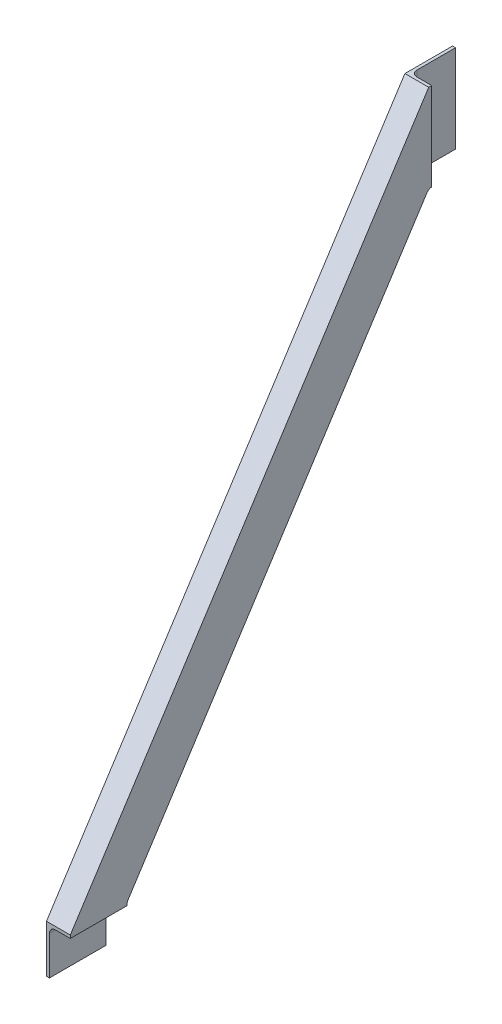
ISO-10303-21;
HEADER;
FILE_DESCRIPTION(('STEP AP214'),'2;1');
FILE_NAME('part.step','',(''),(''),'','','');
FILE_SCHEMA(('AUTOMOTIVE_DESIGN { 1 0 10303 214 1 1 1 1 }'));
ENDSEC;
DATA;
#1=APPLICATION_CONTEXT('core data for automotive mechanical design processes');
#2=APPLICATION_PROTOCOL_DEFINITION('international standard','automotive_design',2000,#1);
#3=PRODUCT_CONTEXT('',#1,'mechanical');
#4=PRODUCT('Part','Part','',(#3));
#5=PRODUCT_RELATED_PRODUCT_CATEGORY('part','',(#4));
#6=PRODUCT_DEFINITION_FORMATION('','',#4);
#7=PRODUCT_DEFINITION_CONTEXT('part definition',#1,'design');
#8=PRODUCT_DEFINITION('design','',#6,#7);
#9=PRODUCT_DEFINITION_SHAPE('','',#8);
#10=(LENGTH_UNIT() NAMED_UNIT(*) SI_UNIT(.MILLI.,.METRE.));
#11=(NAMED_UNIT(*) PLANE_ANGLE_UNIT() SI_UNIT($,.RADIAN.));
#12=(NAMED_UNIT(*) SI_UNIT($,.STERADIAN.) SOLID_ANGLE_UNIT());
#13=UNCERTAINTY_MEASURE_WITH_UNIT(LENGTH_MEASURE(1.E-05),#10,'distance_accuracy_value','');
#14=(GEOMETRIC_REPRESENTATION_CONTEXT(3) GLOBAL_UNCERTAINTY_ASSIGNED_CONTEXT((#13)) GLOBAL_UNIT_ASSIGNED_CONTEXT((#10,
#11,#12)) REPRESENTATION_CONTEXT('',''));
#15=CARTESIAN_POINT('',(0.,0.,0.));
#16=DIRECTION('',(0.,0.,1.));
#17=DIRECTION('',(1.,0.,0.));
#18=AXIS2_PLACEMENT_3D('',#15,#16,#17);
#19=CARTESIAN_POINT('',(317.5,624.31750802795,-255.641735062209));
#20=DIRECTION('',(-1.,0.,0.));
#21=DIRECTION('',(0.,0.,1.));
#22=AXIS2_PLACEMENT_3D('',#19,#20,#21);
#23=PLANE('',#22);
#24=DIRECTION('',(0.,-0.840039377768771,0.542525431475664));
#25=VECTOR('',#24,1.);
#26=CARTESIAN_POINT('',(317.5,624.31750802795,-255.641735062209));
#27=LINE('',#26,#25);
#28=CARTESIAN_POINT('',(317.5,520.547922486012,-188.623877733041));
#29=VERTEX_POINT('',#28);
#30=CARTESIAN_POINT('',(317.5,26.9727741179381,130.143405588006));
#31=VERTEX_POINT('',#30);
#32=EDGE_CURVE('E290',#29,#31,#27,.T.);
#33=ORIENTED_EDGE('',*,*,#32,.F.);
#34=CARTESIAN_POINT('',(317.5,517.102885996141,-193.958127781873));
#35=DIRECTION('',(-1.,0.,0.));
#36=DIRECTION('',(0.,0.,1.));
#37=AXIS2_PLACEMENT_3D('',#34,#35,#36);
#38=CIRCLE('',#37,6.35);
#39=CARTESIAN_POINT('',(317.5,523.446570939385,-193.675));
#40=VERTEX_POINT('',#39);
#41=EDGE_CURVE('E330',#29,#40,#38,.T.);
#42=ORIENTED_EDGE('',*,*,#41,.T.);
#43=DIRECTION('',(0.,1.,0.));
#44=VECTOR('',#43,1.);
#45=CARTESIAN_POINT('',(317.5,523.452885996141,-193.675));
#46=LINE('',#45,#44);
#47=CARTESIAN_POINT('',(317.5,617.08904948773,-193.675));
#48=VERTEX_POINT('',#47);
#49=EDGE_CURVE('E61',#40,#48,#46,.T.);
#50=ORIENTED_EDGE('',*,*,#49,.T.);
#51=DIRECTION('',(0.,0.,-1.));
#52=VECTOR('',#51,1.);
#53=CARTESIAN_POINT('',(317.5,617.08904948773,0.));
#54=LINE('',#53,#52);
#55=CARTESIAN_POINT('',(317.5,617.08904948773,-190.5));
#56=VERTEX_POINT('',#55);
#57=EDGE_CURVE('E235',#56,#48,#54,.T.);
#58=ORIENTED_EDGE('',*,*,#57,.F.);
#59=DIRECTION('',(0.,-0.840039377768771,0.542525431475664));
#60=VECTOR('',#59,1.);
#61=CARTESIAN_POINT('',(317.5,651.877799946913,-212.967734671556));
#62=LINE('',#61,#60);
#63=CARTESIAN_POINT('',(317.5,25.4,191.632511127492));
#64=VERTEX_POINT('',#63);
#65=EDGE_CURVE('E293',#56,#64,#62,.T.);
#66=ORIENTED_EDGE('',*,*,#65,.T.);
#67=DIRECTION('',(0.,-1.,0.));
#68=VECTOR('',#67,1.);
#69=CARTESIAN_POINT('',(317.5,0.,191.632511127492));
#70=LINE('',#69,#68);
#71=CARTESIAN_POINT('',(317.5,22.225,191.632511127492));
#72=VERTEX_POINT('',#71);
#73=EDGE_CURVE('E188',#64,#72,#70,.T.);
#74=ORIENTED_EDGE('',*,*,#73,.T.);
#75=DIRECTION('',(0.,0.,1.));
#76=VECTOR('',#75,1.);
#77=CARTESIAN_POINT('',(317.5,22.225,131.159155539174));
#78=LINE('',#77,#76);
#79=CARTESIAN_POINT('',(317.5,22.225,131.159155539174));
#80=VERTEX_POINT('',#79);
#81=EDGE_CURVE('E220',#80,#72,#78,.T.);
#82=ORIENTED_EDGE('',*,*,#81,.F.);
#83=DIRECTION('',(0.,-1.,0.));
#84=VECTOR('',#83,1.);
#85=CARTESIAN_POINT('',(317.5,0.,131.159155539174));
#86=LINE('',#85,#84);
#87=CARTESIAN_POINT('',(317.5,23.5277376280677,131.159155539174));
#88=VERTEX_POINT('',#87);
#89=EDGE_CURVE('E198',#88,#80,#86,.T.);
#90=ORIENTED_EDGE('',*,*,#89,.F.);
#91=CARTESIAN_POINT('',(317.5,23.5277376280677,124.809155539174));
#92=DIRECTION('',(-1.,0.,0.));
#93=DIRECTION('',(0.,0.,1.));
#94=AXIS2_PLACEMENT_3D('',#91,#92,#93);
#95=CIRCLE('',#94,6.35);
#96=EDGE_CURVE('E47',#88,#31,#95,.T.);
#97=ORIENTED_EDGE('',*,*,#96,.T.);
#98=EDGE_LOOP('',(#33,#42,#50,#58,#66,#74,#82,#90,#97));
#99=FACE_BOUND('',#98,.T.);
#100=ADVANCED_FACE('F38',(#99),#23,.F.);
#101=CARTESIAN_POINT('',(292.1,651.877799946913,-212.967734671556));
#102=DIRECTION('',(0.,-0.542525431475664,-0.840039377768771));
#103=DIRECTION('',(0.,0.840039377768771,-0.542525431475664));
#104=AXIS2_PLACEMENT_3D('',#101,#102,#103);
#105=PLANE('',#104);
#106=DIRECTION('',(1.,0.,0.));
#107=VECTOR('',#106,1.);
#108=CARTESIAN_POINT('',(292.1,617.08904948773,-190.5));
#109=LINE('',#108,#107);
#110=CARTESIAN_POINT('',(292.1,617.08904948773,-190.5));
#111=VERTEX_POINT('',#110);
#112=EDGE_CURVE('E275',#111,#56,#109,.T.);
#113=ORIENTED_EDGE('',*,*,#112,.F.);
#114=DIRECTION('',(0.,-0.840039377768771,0.542525431475664));
#115=VECTOR('',#114,1.);
#116=CARTESIAN_POINT('',(292.1,651.877799946913,-212.967734671556));
#117=LINE('',#116,#115);
#118=CARTESIAN_POINT('',(292.1,25.4,191.632511127492));
#119=VERTEX_POINT('',#118);
#120=EDGE_CURVE('E295',#111,#119,#117,.T.);
#121=ORIENTED_EDGE('',*,*,#120,.T.);
#122=DIRECTION('',(-1.,0.,0.));
#123=VECTOR('',#122,1.);
#124=CARTESIAN_POINT('',(292.1,25.4,191.632511127492));
#125=LINE('',#124,#123);
#126=EDGE_CURVE('E262',#64,#119,#125,.T.);
#127=ORIENTED_EDGE('',*,*,#126,.F.);
#128=ORIENTED_EDGE('',*,*,#65,.F.);
#129=EDGE_LOOP('',(#113,#121,#127,#128));
#130=FACE_BOUND('',#129,.T.);
#131=ADVANCED_FACE('F356',(#130),#105,.F.);
#132=CARTESIAN_POINT('',(292.1,624.31750802795,-255.641735062209));
#133=DIRECTION('',(1.,0.,0.));
#134=DIRECTION('',(0.,0.,-1.));
#135=AXIS2_PLACEMENT_3D('',#132,#133,#134);
#136=PLANE('',#135);
#137=ORIENTED_EDGE('',*,*,#120,.F.);
#138=DIRECTION('',(0.,0.,-1.));
#139=VECTOR('',#138,1.);
#140=CARTESIAN_POINT('',(292.1,617.08904948773,0.));
#141=LINE('',#140,#139);
#142=CARTESIAN_POINT('',(292.1,617.08904948773,-241.3));
#143=VERTEX_POINT('',#142);
#144=EDGE_CURVE('E223',#111,#143,#141,.T.);
#145=ORIENTED_EDGE('',*,*,#144,.T.);
#146=DIRECTION('',(0.,1.,0.));
#147=VECTOR('',#146,1.);
#148=CARTESIAN_POINT('',(292.1,523.452885996141,-241.3));
#149=LINE('',#148,#147);
#150=CARTESIAN_POINT('',(292.1,523.452885996141,-241.3));
#151=VERTEX_POINT('',#150);
#152=EDGE_CURVE('E245',#151,#143,#149,.T.);
#153=ORIENTED_EDGE('',*,*,#152,.F.);
#154=DIRECTION('',(0.,0.,-1.));
#155=VECTOR('',#154,1.);
#156=CARTESIAN_POINT('',(292.1,523.452885996141,0.));
#157=LINE('',#156,#155);
#158=CARTESIAN_POINT('',(292.1,523.452885996141,-193.958127781873));
#159=VERTEX_POINT('',#158);
#160=EDGE_CURVE('E225',#159,#151,#157,.T.);
#161=ORIENTED_EDGE('',*,*,#160,.F.);
#162=CARTESIAN_POINT('',(292.1,517.102885996141,-193.958127781873));
#163=DIRECTION('',(1.,0.,0.));
#164=DIRECTION('',(0.,0.,-1.));
#165=AXIS2_PLACEMENT_3D('',#162,#163,#164);
#166=CIRCLE('',#165,6.35);
#167=CARTESIAN_POINT('',(292.1,520.547922486012,-188.623877733041));
#168=VERTEX_POINT('',#167);
#169=EDGE_CURVE('E328',#159,#168,#166,.T.);
#170=ORIENTED_EDGE('',*,*,#169,.T.);
#171=DIRECTION('',(0.,-0.840039377768771,0.542525431475664));
#172=VECTOR('',#171,1.);
#173=CARTESIAN_POINT('',(292.1,624.31750802795,-255.641735062209));
#174=LINE('',#173,#172);
#175=CARTESIAN_POINT('',(292.1,26.9727741179381,130.143405588006));
#176=VERTEX_POINT('',#175);
#177=EDGE_CURVE('E297',#168,#176,#174,.T.);
#178=ORIENTED_EDGE('',*,*,#177,.T.);
#179=CARTESIAN_POINT('',(292.1,23.5277376280677,124.809155539174));
#180=DIRECTION('',(1.,0.,0.));
#181=DIRECTION('',(0.,0.,-1.));
#182=AXIS2_PLACEMENT_3D('',#179,#180,#181);
#183=CIRCLE('',#182,6.35);
#184=CARTESIAN_POINT('',(292.1,23.5277376280677,131.159155539174));
#185=VERTEX_POINT('',#184);
#186=EDGE_CURVE('E11',#176,#185,#183,.T.);
#187=ORIENTED_EDGE('',*,*,#186,.T.);
#188=DIRECTION('',(0.,-1.,0.));
#189=VECTOR('',#188,1.);
#190=CARTESIAN_POINT('',(292.1,0.,131.159155539174));
#191=LINE('',#190,#189);
#192=CARTESIAN_POINT('',(292.1,-25.4,131.159155539174));
#193=VERTEX_POINT('',#192);
#194=EDGE_CURVE('E174',#185,#193,#191,.T.);
#195=ORIENTED_EDGE('',*,*,#194,.T.);
#196=DIRECTION('',(0.,0.,1.));
#197=VECTOR('',#196,1.);
#198=CARTESIAN_POINT('',(292.1,-25.4,131.159155539174));
#199=LINE('',#198,#197);
#200=CARTESIAN_POINT('',(292.1,-25.4,191.632511127492));
#201=VERTEX_POINT('',#200);
#202=EDGE_CURVE('E179',#193,#201,#199,.T.);
#203=ORIENTED_EDGE('',*,*,#202,.T.);
#204=DIRECTION('',(0.,-1.,0.));
#205=VECTOR('',#204,1.);
#206=CARTESIAN_POINT('',(292.1,0.,191.632511127492));
#207=LINE('',#206,#205);
#208=EDGE_CURVE('E211',#119,#201,#207,.T.);
#209=ORIENTED_EDGE('',*,*,#208,.F.);
#210=EDGE_LOOP('',(#137,#145,#153,#161,#170,#178,#187,#195,#203,#209));
#211=FACE_BOUND('',#210,.T.);
#212=ADVANCED_FACE('F177',(#211),#136,.F.);
#213=CARTESIAN_POINT('',(292.1,624.31750802795,-255.641735062209));
#214=DIRECTION('',(0.,0.542525431475664,0.840039377768771));
#215=DIRECTION('',(0.,-0.840039377768771,0.542525431475664));
#216=AXIS2_PLACEMENT_3D('',#213,#214,#215);
#217=PLANE('',#216);
#218=ORIENTED_EDGE('',*,*,#177,.F.);
#219=DIRECTION('',(-1.,0.,0.));
#220=VECTOR('',#219,1.);
#221=CARTESIAN_POINT('',(317.5,520.547922486012,-188.623877733041));
#222=LINE('',#221,#220);
#223=EDGE_CURVE('E324',#168,#29,#222,.F.);
#224=ORIENTED_EDGE('',*,*,#223,.T.);
#225=ORIENTED_EDGE('',*,*,#32,.T.);
#226=DIRECTION('',(1.,0.,0.));
#227=VECTOR('',#226,1.);
#228=CARTESIAN_POINT('',(292.1,26.9727741179382,130.143405588006));
#229=LINE('',#228,#227);
#230=EDGE_CURVE('E322',#31,#176,#229,.F.);
#231=ORIENTED_EDGE('',*,*,#230,.T.);
#232=EDGE_LOOP('',(#218,#224,#225,#231));
#233=FACE_BOUND('',#232,.T.);
#234=ADVANCED_FACE('F370',(#233),#217,.F.);
#235=CARTESIAN_POINT('',(0.,523.452885996141,-241.3));
#236=DIRECTION('',(0.,0.,-1.));
#237=DIRECTION('',(-1.,0.,0.));
#238=AXIS2_PLACEMENT_3D('',#235,#236,#237);
#239=PLANE('',#238);
#240=DIRECTION('',(-1.,0.,0.));
#241=VECTOR('',#240,1.);
#242=CARTESIAN_POINT('',(0.,617.08904948773,-241.3));
#243=LINE('',#242,#241);
#244=CARTESIAN_POINT('',(295.275,617.08904948773,-241.3));
#245=VERTEX_POINT('',#244);
#246=EDGE_CURVE('E228',#245,#143,#243,.T.);
#247=ORIENTED_EDGE('',*,*,#246,.F.);
#248=DIRECTION('',(0.,1.,0.));
#249=VECTOR('',#248,1.);
#250=CARTESIAN_POINT('',(295.275,523.452885996141,-241.3));
#251=LINE('',#250,#249);
#252=CARTESIAN_POINT('',(295.275,523.452885996141,-241.3));
#253=VERTEX_POINT('',#252);
#254=EDGE_CURVE('E248',#253,#245,#251,.T.);
#255=ORIENTED_EDGE('',*,*,#254,.F.);
#256=DIRECTION('',(-1.,0.,0.));
#257=VECTOR('',#256,1.);
#258=CARTESIAN_POINT('',(0.,523.452885996141,-241.3));
#259=LINE('',#258,#257);
#260=EDGE_CURVE('E230',#253,#151,#259,.T.);
#261=ORIENTED_EDGE('',*,*,#260,.T.);
#262=ORIENTED_EDGE('',*,*,#152,.T.);
#263=EDGE_LOOP('',(#247,#255,#261,#262));
#264=FACE_BOUND('',#263,.T.);
#265=ADVANCED_FACE('F372',(#264),#239,.T.);
#266=CARTESIAN_POINT('',(295.275,523.452885996141,0.));
#267=DIRECTION('',(1.,0.,0.));
#268=DIRECTION('',(0.,0.,-1.));
#269=AXIS2_PLACEMENT_3D('',#266,#267,#268);
#270=PLANE('',#269);
#271=DIRECTION('',(0.,0.,-1.));
#272=VECTOR('',#271,1.);
#273=CARTESIAN_POINT('',(295.275,617.08904948773,0.));
#274=LINE('',#273,#272);
#275=CARTESIAN_POINT('',(295.275,617.08904948773,-200.025));
#276=VERTEX_POINT('',#275);
#277=EDGE_CURVE('E241',#276,#245,#274,.T.);
#278=ORIENTED_EDGE('',*,*,#277,.F.);
#279=DIRECTION('',(0.,1.,0.));
#280=VECTOR('',#279,1.);
#281=CARTESIAN_POINT('',(295.275,523.452885996141,-200.025));
#282=LINE('',#281,#280);
#283=CARTESIAN_POINT('',(295.275,523.452885996141,-200.025));
#284=VERTEX_POINT('',#283);
#285=EDGE_CURVE('E303',#276,#284,#282,.F.);
#286=ORIENTED_EDGE('',*,*,#285,.T.);
#287=DIRECTION('',(0.,0.,-1.));
#288=VECTOR('',#287,1.);
#289=CARTESIAN_POINT('',(295.275,523.452885996141,0.));
#290=LINE('',#289,#288);
#291=EDGE_CURVE('E227',#284,#253,#290,.T.);
#292=ORIENTED_EDGE('',*,*,#291,.T.);
#293=ORIENTED_EDGE('',*,*,#254,.T.);
#294=EDGE_LOOP('',(#278,#286,#292,#293));
#295=FACE_BOUND('',#294,.T.);
#296=ADVANCED_FACE('F377',(#295),#270,.T.);
#297=CARTESIAN_POINT('',(0.,523.452885996141,-193.675));
#298=DIRECTION('',(0.,0.,-1.));
#299=DIRECTION('',(-1.,0.,0.));
#300=AXIS2_PLACEMENT_3D('',#297,#298,#299);
#301=PLANE('',#300);
#302=ORIENTED_EDGE('',*,*,#49,.F.);
#303=DIRECTION('',(1.,0.,0.));
#304=VECTOR('',#303,1.);
#305=CARTESIAN_POINT('',(317.5,523.446570939385,-193.675));
#306=LINE('',#305,#304);
#307=CARTESIAN_POINT('',(301.625,523.446570939385,-193.675));
#308=VERTEX_POINT('',#307);
#309=EDGE_CURVE('E332',#40,#308,#306,.F.);
#310=ORIENTED_EDGE('',*,*,#309,.T.);
#311=DIRECTION('',(0.,1.,0.));
#312=VECTOR('',#311,1.);
#313=CARTESIAN_POINT('',(301.625,617.08904948773,-193.675));
#314=LINE('',#313,#312);
#315=CARTESIAN_POINT('',(301.625,617.08904948773,-193.675));
#316=VERTEX_POINT('',#315);
#317=EDGE_CURVE('E54',#308,#316,#314,.T.);
#318=ORIENTED_EDGE('',*,*,#317,.T.);
#319=DIRECTION('',(-1.,0.,0.));
#320=VECTOR('',#319,1.);
#321=CARTESIAN_POINT('',(0.,617.08904948773,-193.675));
#322=LINE('',#321,#320);
#323=EDGE_CURVE('E238',#48,#316,#322,.T.);
#324=ORIENTED_EDGE('',*,*,#323,.F.);
#325=EDGE_LOOP('',(#302,#310,#318,#324));
#326=FACE_BOUND('',#325,.T.);
#327=ADVANCED_FACE('F419',(#326),#301,.T.);
#328=CARTESIAN_POINT('',(0.,523.452885996141,0.));
#329=DIRECTION('',(0.,1.,0.));
#330=DIRECTION('',(0.,0.,1.));
#331=AXIS2_PLACEMENT_3D('',#328,#329,#330);
#332=PLANE('',#331);
#333=CARTESIAN_POINT('',(301.625,523.452885996141,-200.025));
#334=DIRECTION('',(0.,1.,0.));
#335=DIRECTION('',(0.,0.,1.));
#336=AXIS2_PLACEMENT_3D('',#333,#334,#335);
#337=CIRCLE('',#336,6.35);
#338=CARTESIAN_POINT('',(299.750016936365,523.452885996141,-193.958127781873));
#339=VERTEX_POINT('',#338);
#340=EDGE_CURVE('E312',#284,#339,#337,.T.);
#341=ORIENTED_EDGE('',*,*,#340,.T.);
#342=DIRECTION('',(-1.,0.,0.));
#343=VECTOR('',#342,1.);
#344=CARTESIAN_POINT('',(292.1,523.452885996141,-193.958127781873));
#345=LINE('',#344,#343);
#346=EDGE_CURVE('E319',#339,#159,#345,.T.);
#347=ORIENTED_EDGE('',*,*,#346,.T.);
#348=ORIENTED_EDGE('',*,*,#160,.T.);
#349=ORIENTED_EDGE('',*,*,#260,.F.);
#350=ORIENTED_EDGE('',*,*,#291,.F.);
#351=EDGE_LOOP('',(#341,#347,#348,#349,#350));
#352=FACE_BOUND('',#351,.T.);
#353=ADVANCED_FACE('F413',(#352),#332,.F.);
#354=CARTESIAN_POINT('',(0.,617.08904948773,0.));
#355=DIRECTION('',(0.,1.,0.));
#356=DIRECTION('',(0.,0.,1.));
#357=AXIS2_PLACEMENT_3D('',#354,#355,#356);
#358=PLANE('',#357);
#359=ORIENTED_EDGE('',*,*,#144,.F.);
#360=ORIENTED_EDGE('',*,*,#112,.T.);
#361=ORIENTED_EDGE('',*,*,#57,.T.);
#362=ORIENTED_EDGE('',*,*,#323,.T.);
#363=CARTESIAN_POINT('',(301.625,617.08904948773,-200.025));
#364=DIRECTION('',(0.,1.,0.));
#365=DIRECTION('',(0.,0.,1.));
#366=AXIS2_PLACEMENT_3D('',#363,#364,#365);
#367=CIRCLE('',#366,6.35);
#368=EDGE_CURVE('E310',#316,#276,#367,.F.);
#369=ORIENTED_EDGE('',*,*,#368,.T.);
#370=ORIENTED_EDGE('',*,*,#277,.T.);
#371=ORIENTED_EDGE('',*,*,#246,.T.);
#372=EDGE_LOOP('',(#359,#360,#361,#362,#369,#370,#371));
#373=FACE_BOUND('',#372,.T.);
#374=ADVANCED_FACE('F406',(#373),#358,.T.);
#375=CARTESIAN_POINT('',(0.,22.225,131.159155539174));
#376=DIRECTION('',(0.,1.,0.));
#377=DIRECTION('',(-1.,0.,0.));
#378=AXIS2_PLACEMENT_3D('',#375,#376,#377);
#379=PLANE('',#378);
#380=DIRECTION('',(-1.,0.,0.));
#381=VECTOR('',#380,1.);
#382=CARTESIAN_POINT('',(0.,22.225,191.632511127492));
#383=LINE('',#382,#381);
#384=CARTESIAN_POINT('',(301.625,22.225,191.632511127492));
#385=VERTEX_POINT('',#384);
#386=EDGE_CURVE('E216',#72,#385,#383,.T.);
#387=ORIENTED_EDGE('',*,*,#386,.T.);
#388=DIRECTION('',(0.,0.,1.));
#389=VECTOR('',#388,1.);
#390=CARTESIAN_POINT('',(301.625,22.225,131.159155539174));
#391=LINE('',#390,#389);
#392=CARTESIAN_POINT('',(301.625,22.225,131.159155539174));
#393=VERTEX_POINT('',#392);
#394=EDGE_CURVE('E308',#385,#393,#391,.F.);
#395=ORIENTED_EDGE('',*,*,#394,.T.);
#396=DIRECTION('',(-1.,0.,0.));
#397=VECTOR('',#396,1.);
#398=CARTESIAN_POINT('',(0.,22.225,131.159155539174));
#399=LINE('',#398,#397);
#400=EDGE_CURVE('E205',#80,#393,#399,.T.);
#401=ORIENTED_EDGE('',*,*,#400,.F.);
#402=ORIENTED_EDGE('',*,*,#81,.T.);
#403=EDGE_LOOP('',(#387,#395,#401,#402));
#404=FACE_BOUND('',#403,.T.);
#405=ADVANCED_FACE('F395',(#404),#379,.F.);
#406=CARTESIAN_POINT('',(295.275,0.,131.159155539174));
#407=DIRECTION('',(-1.,0.,0.));
#408=DIRECTION('',(0.,0.,1.));
#409=AXIS2_PLACEMENT_3D('',#406,#407,#408);
#410=PLANE('',#409);
#411=DIRECTION('',(0.,-1.,0.));
#412=VECTOR('',#411,1.);
#413=CARTESIAN_POINT('',(295.275,0.,131.159155539174));
#414=LINE('',#413,#412);
#415=CARTESIAN_POINT('',(295.275,15.875,131.159155539174));
#416=VERTEX_POINT('',#415);
#417=CARTESIAN_POINT('',(295.275,-25.4,131.159155539174));
#418=VERTEX_POINT('',#417);
#419=EDGE_CURVE('E202',#416,#418,#414,.T.);
#420=ORIENTED_EDGE('',*,*,#419,.F.);
#421=DIRECTION('',(0.,0.,1.));
#422=VECTOR('',#421,1.);
#423=CARTESIAN_POINT('',(295.275,15.875,191.632511127492));
#424=LINE('',#423,#422);
#425=CARTESIAN_POINT('',(295.275,15.875,191.632511127492));
#426=VERTEX_POINT('',#425);
#427=EDGE_CURVE('E305',#416,#426,#424,.T.);
#428=ORIENTED_EDGE('',*,*,#427,.T.);
#429=DIRECTION('',(0.,-1.,0.));
#430=VECTOR('',#429,1.);
#431=CARTESIAN_POINT('',(295.275,0.,191.632511127492));
#432=LINE('',#431,#430);
#433=CARTESIAN_POINT('',(295.275,-25.4,191.632511127492));
#434=VERTEX_POINT('',#433);
#435=EDGE_CURVE('E214',#426,#434,#432,.T.);
#436=ORIENTED_EDGE('',*,*,#435,.T.);
#437=DIRECTION('',(0.,0.,1.));
#438=VECTOR('',#437,1.);
#439=CARTESIAN_POINT('',(295.275,-25.4,131.159155539174));
#440=LINE('',#439,#438);
#441=EDGE_CURVE('E197',#418,#434,#440,.T.);
#442=ORIENTED_EDGE('',*,*,#441,.F.);
#443=EDGE_LOOP('',(#420,#428,#436,#442));
#444=FACE_BOUND('',#443,.T.);
#445=ADVANCED_FACE('F400',(#444),#410,.F.);
#446=CARTESIAN_POINT('',(0.,-25.4000000000006,131.159155539174));
#447=DIRECTION('',(0.,-1.,0.));
#448=DIRECTION('',(1.,0.,0.));
#449=AXIS2_PLACEMENT_3D('',#446,#447,#448);
#450=PLANE('',#449);
#451=DIRECTION('',(1.,0.,0.));
#452=VECTOR('',#451,1.);
#453=CARTESIAN_POINT('',(0.,-25.4000000000006,191.632511127492));
#454=LINE('',#453,#452);
#455=EDGE_CURVE('E195',#201,#434,#454,.T.);
#456=ORIENTED_EDGE('',*,*,#455,.F.);
#457=ORIENTED_EDGE('',*,*,#202,.F.);
#458=DIRECTION('',(1.,0.,0.));
#459=VECTOR('',#458,1.);
#460=CARTESIAN_POINT('',(0.,-25.4000000000006,131.159155539174));
#461=LINE('',#460,#459);
#462=EDGE_CURVE('E187',#193,#418,#461,.T.);
#463=ORIENTED_EDGE('',*,*,#462,.T.);
#464=ORIENTED_EDGE('',*,*,#441,.T.);
#465=EDGE_LOOP('',(#456,#457,#463,#464));
#466=FACE_BOUND('',#465,.T.);
#467=ADVANCED_FACE('F192',(#466),#450,.T.);
#468=CARTESIAN_POINT('',(0.,0.,131.159155539174));
#469=DIRECTION('',(0.,0.,1.));
#470=DIRECTION('',(1.,0.,0.));
#471=AXIS2_PLACEMENT_3D('',#468,#469,#470);
#472=PLANE('',#471);
#473=ORIENTED_EDGE('',*,*,#194,.F.);
#474=DIRECTION('',(1.,0.,0.));
#475=VECTOR('',#474,1.);
#476=CARTESIAN_POINT('',(317.5,23.5277376280677,131.159155539174));
#477=LINE('',#476,#475);
#478=EDGE_CURVE('E326',#185,#88,#477,.T.);
#479=ORIENTED_EDGE('',*,*,#478,.T.);
#480=ORIENTED_EDGE('',*,*,#89,.T.);
#481=ORIENTED_EDGE('',*,*,#400,.T.);
#482=CARTESIAN_POINT('',(301.625,15.875,131.159155539174));
#483=DIRECTION('',(0.,0.,1.));
#484=DIRECTION('',(1.,0.,0.));
#485=AXIS2_PLACEMENT_3D('',#482,#483,#484);
#486=CIRCLE('',#485,6.35);
#487=EDGE_CURVE('E317',#393,#416,#486,.T.);
#488=ORIENTED_EDGE('',*,*,#487,.T.);
#489=ORIENTED_EDGE('',*,*,#419,.T.);
#490=ORIENTED_EDGE('',*,*,#462,.F.);
#491=EDGE_LOOP('',(#473,#479,#480,#481,#488,#489,#490));
#492=FACE_BOUND('',#491,.T.);
#493=ADVANCED_FACE('F200',(#492),#472,.F.);
#494=CARTESIAN_POINT('',(0.,0.,191.632511127492));
#495=DIRECTION('',(0.,0.,1.));
#496=DIRECTION('',(1.,0.,0.));
#497=AXIS2_PLACEMENT_3D('',#494,#495,#496);
#498=PLANE('',#497);
#499=ORIENTED_EDGE('',*,*,#126,.T.);
#500=ORIENTED_EDGE('',*,*,#208,.T.);
#501=ORIENTED_EDGE('',*,*,#455,.T.);
#502=ORIENTED_EDGE('',*,*,#435,.F.);
#503=CARTESIAN_POINT('',(301.625,15.875,191.632511127492));
#504=DIRECTION('',(0.,0.,1.));
#505=DIRECTION('',(1.,0.,0.));
#506=AXIS2_PLACEMENT_3D('',#503,#504,#505);
#507=CIRCLE('',#506,6.35);
#508=EDGE_CURVE('E315',#426,#385,#507,.F.);
#509=ORIENTED_EDGE('',*,*,#508,.T.);
#510=ORIENTED_EDGE('',*,*,#386,.F.);
#511=ORIENTED_EDGE('',*,*,#73,.F.);
#512=EDGE_LOOP('',(#499,#500,#501,#502,#509,#510,#511));
#513=FACE_BOUND('',#512,.T.);
#514=ADVANCED_FACE('F353',(#513),#498,.T.);
#515=CARTESIAN_POINT('',(301.625,523.452885996141,-200.025));
#516=DIRECTION('',(0.,-1.,0.));
#517=DIRECTION('',(0.,0.,-1.));
#518=AXIS2_PLACEMENT_3D('',#515,#516,#517);
#519=CYLINDRICAL_SURFACE('',#518,6.35);
#520=ORIENTED_EDGE('',*,*,#340,.F.);
#521=ORIENTED_EDGE('',*,*,#285,.F.);
#522=ORIENTED_EDGE('',*,*,#368,.F.);
#523=ORIENTED_EDGE('',*,*,#317,.F.);
#524=CARTESIAN_POINT('',(301.625,523.446570939385,-193.675));
#525=CARTESIAN_POINT('',(301.465940144365,523.446537000419,-193.674988850834));
#526=CARTESIAN_POINT('',(301.306882792865,523.446837751203,-193.68097635739));
#527=CARTESIAN_POINT('',(300.990551951398,523.447850197483,-193.70479762534));
#528=CARTESIAN_POINT('',(300.833273459939,523.448559589739,-193.722565075118));
#529=CARTESIAN_POINT('',(300.520483957646,523.450136199672,-193.769797246216));
#530=CARTESIAN_POINT('',(300.364972943094,523.451003417015,-193.799261942928));
#531=CARTESIAN_POINT('',(300.055714457847,523.452364684319,-193.869906445475));
#532=CARTESIAN_POINT('',(299.901981790692,523.452856611793,-193.911151097018));
#533=CARTESIAN_POINT('',(299.750016936365,523.452885996141,-193.958127781873));
#534=B_SPLINE_CURVE_WITH_KNOTS('',3,(#524,#525,#526,#527,#528,#529,#530,#531,#532,#533),
.UNSPECIFIED.,.F.,.F.,(4,2,2,2,4),(0.,0.477062624549157,0.951462315232409,1.42586100787502,
1.90292321330274),.UNSPECIFIED.);
#535=EDGE_CURVE('E334',#308,#339,#534,.T.);
#536=ORIENTED_EDGE('',*,*,#535,.T.);
#537=EDGE_LOOP('',(#520,#521,#522,#523,#536));
#538=FACE_BOUND('',#537,.T.);
#539=ADVANCED_FACE('F339',(#538),#519,.F.);
#540=CARTESIAN_POINT('',(301.625,15.875,131.159155539174));
#541=DIRECTION('',(0.,0.,-1.));
#542=DIRECTION('',(-1.,0.,0.));
#543=AXIS2_PLACEMENT_3D('',#540,#541,#542);
#544=CYLINDRICAL_SURFACE('',#543,6.35);
#545=ORIENTED_EDGE('',*,*,#487,.F.);
#546=ORIENTED_EDGE('',*,*,#394,.F.);
#547=ORIENTED_EDGE('',*,*,#508,.F.);
#548=ORIENTED_EDGE('',*,*,#427,.F.);
#549=EDGE_LOOP('',(#545,#546,#547,#548));
#550=FACE_BOUND('',#549,.T.);
#551=ADVANCED_FACE('F346',(#550),#544,.F.);
#552=CARTESIAN_POINT('',(0.,517.102885996141,-193.958127781873));
#553=DIRECTION('',(1.,0.,0.));
#554=DIRECTION('',(0.,0.,-1.));
#555=AXIS2_PLACEMENT_3D('',#552,#553,#554);
#556=CYLINDRICAL_SURFACE('',#555,6.35);
#557=ORIENTED_EDGE('',*,*,#41,.F.);
#558=ORIENTED_EDGE('',*,*,#223,.F.);
#559=ORIENTED_EDGE('',*,*,#169,.F.);
#560=ORIENTED_EDGE('',*,*,#346,.F.);
#561=ORIENTED_EDGE('',*,*,#535,.F.);
#562=ORIENTED_EDGE('',*,*,#309,.F.);
#563=EDGE_LOOP('',(#557,#558,#559,#560,#561,#562));
#564=FACE_BOUND('',#563,.T.);
#565=ADVANCED_FACE('F343',(#564),#556,.F.);
#566=CARTESIAN_POINT('',(0.,23.5277376280677,124.809155539174));
#567=DIRECTION('',(-1.,0.,0.));
#568=DIRECTION('',(0.,0.,1.));
#569=AXIS2_PLACEMENT_3D('',#566,#567,#568);
#570=CYLINDRICAL_SURFACE('',#569,6.35);
#571=ORIENTED_EDGE('',*,*,#186,.F.);
#572=ORIENTED_EDGE('',*,*,#230,.F.);
#573=ORIENTED_EDGE('',*,*,#96,.F.);
#574=ORIENTED_EDGE('',*,*,#478,.F.);
#575=EDGE_LOOP('',(#571,#572,#573,#574));
#576=FACE_BOUND('',#575,.T.);
#577=ADVANCED_FACE('F40',(#576),#570,.F.);
#578=CLOSED_SHELL('',(#100,#131,#212,#234,#265,#296,#327,#353,#374,#405,#445,#467,#493,#514,
#539,#551,#565,#577));
#579=CARTESIAN_POINT('',(0.,523.452885996141,-190.5));
#580=DIRECTION('',(0.,0.,-1.));
#581=DIRECTION('',(-1.,0.,0.));
#582=AXIS2_PLACEMENT_3D('',#579,#580,#581);
#583=PLANE('',#582);
#584=DIRECTION('',(0.,1.,0.));
#585=VECTOR('',#584,1.);
#586=CARTESIAN_POINT('',(293.6875,625.178767150417,-190.5));
#587=LINE('',#586,#585);
#588=CARTESIAN_POINT('',(293.6875,526.379016105254,-190.5));
#589=VERTEX_POINT('',#588);
#590=CARTESIAN_POINT('',(293.6875,614.162919378618,-190.5));
#591=VERTEX_POINT('',#590);
#592=EDGE_CURVE('E272',#589,#591,#587,.T.);
#593=ORIENTED_EDGE('',*,*,#592,.F.);
#594=DIRECTION('',(-1.,0.,0.));
#595=VECTOR('',#594,1.);
#596=CARTESIAN_POINT('',(293.6875,526.379016105254,-190.5));
#597=LINE('',#596,#595);
#598=CARTESIAN_POINT('',(315.9125,526.379016105254,-190.5));
#599=VERTEX_POINT('',#598);
#600=EDGE_CURVE('E299',#599,#589,#597,.T.);
#601=ORIENTED_EDGE('',*,*,#600,.F.);
#602=DIRECTION('',(0.,-1.,0.));
#603=VECTOR('',#602,1.);
#604=CARTESIAN_POINT('',(315.9125,625.178767150417,-190.5));
#605=LINE('',#604,#603);
#606=CARTESIAN_POINT('',(315.9125,614.162919378618,-190.5));
#607=VERTEX_POINT('',#606);
#608=EDGE_CURVE('E255',#607,#599,#605,.T.);
#609=ORIENTED_EDGE('',*,*,#608,.F.);
#610=DIRECTION('',(1.,0.,0.));
#611=VECTOR('',#610,1.);
#612=CARTESIAN_POINT('',(293.6875,614.162919378618,-190.5));
#613=LINE('',#612,#611);
#614=EDGE_CURVE('E269',#591,#607,#613,.T.);
#615=ORIENTED_EDGE('',*,*,#614,.F.);
#616=EDGE_LOOP('',(#593,#601,#609,#615));
#617=FACE_BOUND('',#616,.T.);
#618=ADVANCED_FACE('F427',(#617),#583,.F.);
#619=CARTESIAN_POINT('',(293.6875,625.178767150417,-254.308172550001));
#620=DIRECTION('',(1.,0.,0.));
#621=DIRECTION('',(0.,0.,-1.));
#622=AXIS2_PLACEMENT_3D('',#619,#620,#621);
#623=PLANE('',#622);
#624=DIRECTION('',(0.,-0.840039377768771,0.542525431475664));
#625=VECTOR('',#624,1.);
#626=CARTESIAN_POINT('',(293.6875,625.178767150417,-254.308172550001));
#627=LINE('',#626,#625);
#628=CARTESIAN_POINT('',(293.6875,25.4,133.048947901309));
#629=VERTEX_POINT('',#628);
#630=EDGE_CURVE('E278',#589,#629,#627,.T.);
#631=ORIENTED_EDGE('',*,*,#630,.F.);
#632=ORIENTED_EDGE('',*,*,#592,.T.);
#633=DIRECTION('',(0.,-0.840039377768771,0.542525431475664));
#634=VECTOR('',#633,1.);
#635=CARTESIAN_POINT('',(293.6875,651.016540824446,-214.301297183764));
#636=LINE('',#635,#634);
#637=CARTESIAN_POINT('',(293.6875,25.4,189.742718765357));
#638=VERTEX_POINT('',#637);
#639=EDGE_CURVE('E287',#591,#638,#636,.T.);
#640=ORIENTED_EDGE('',*,*,#639,.T.);
#641=DIRECTION('',(0.,0.,-1.));
#642=VECTOR('',#641,1.);
#643=CARTESIAN_POINT('',(293.6875,25.4,175.139483093301));
#644=LINE('',#643,#642);
#645=EDGE_CURVE('E259',#638,#629,#644,.T.);
#646=ORIENTED_EDGE('',*,*,#645,.T.);
#647=EDGE_LOOP('',(#631,#632,#640,#646));
#648=FACE_BOUND('',#647,.T.);
#649=ADVANCED_FACE('F366',(#648),#623,.T.);
#650=CARTESIAN_POINT('',(293.6875,625.178767150417,-254.308172550001));
#651=DIRECTION('',(0.,0.542525431475664,0.840039377768771));
#652=DIRECTION('',(0.,-0.840039377768771,0.542525431475664));
#653=AXIS2_PLACEMENT_3D('',#650,#651,#652);
#654=PLANE('',#653);
#655=DIRECTION('',(0.,-0.840039377768771,0.542525431475664));
#656=VECTOR('',#655,1.);
#657=CARTESIAN_POINT('',(315.9125,625.178767150417,-254.308172550001));
#658=LINE('',#657,#656);
#659=CARTESIAN_POINT('',(315.9125,25.4,133.048947901309));
#660=VERTEX_POINT('',#659);
#661=EDGE_CURVE('E281',#599,#660,#658,.T.);
#662=ORIENTED_EDGE('',*,*,#661,.F.);
#663=ORIENTED_EDGE('',*,*,#600,.T.);
#664=ORIENTED_EDGE('',*,*,#630,.T.);
#665=DIRECTION('',(1.,0.,0.));
#666=VECTOR('',#665,1.);
#667=CARTESIAN_POINT('',(293.6875,25.4,133.048947901309));
#668=LINE('',#667,#666);
#669=EDGE_CURVE('E256',#629,#660,#668,.T.);
#670=ORIENTED_EDGE('',*,*,#669,.T.);
#671=EDGE_LOOP('',(#662,#663,#664,#670));
#672=FACE_BOUND('',#671,.T.);
#673=ADVANCED_FACE('F432',(#672),#654,.T.);
#674=CARTESIAN_POINT('',(315.9125,625.178767150417,-254.308172550001));
#675=DIRECTION('',(-1.,0.,0.));
#676=DIRECTION('',(0.,0.,1.));
#677=AXIS2_PLACEMENT_3D('',#674,#675,#676);
#678=PLANE('',#677);
#679=DIRECTION('',(0.,-0.840039377768771,0.542525431475664));
#680=VECTOR('',#679,1.);
#681=CARTESIAN_POINT('',(315.9125,651.016540824446,-214.301297183764));
#682=LINE('',#681,#680);
#683=CARTESIAN_POINT('',(315.9125,25.4,189.742718765357));
#684=VERTEX_POINT('',#683);
#685=EDGE_CURVE('E284',#607,#684,#682,.T.);
#686=ORIENTED_EDGE('',*,*,#685,.F.);
#687=ORIENTED_EDGE('',*,*,#608,.T.);
#688=ORIENTED_EDGE('',*,*,#661,.T.);
#689=DIRECTION('',(0.,0.,1.));
#690=VECTOR('',#689,1.);
#691=CARTESIAN_POINT('',(315.9125,25.4,175.139483093301));
#692=LINE('',#691,#690);
#693=EDGE_CURVE('E252',#660,#684,#692,.T.);
#694=ORIENTED_EDGE('',*,*,#693,.T.);
#695=EDGE_LOOP('',(#686,#687,#688,#694));
#696=FACE_BOUND('',#695,.T.);
#697=ADVANCED_FACE('F435',(#696),#678,.T.);
#698=CARTESIAN_POINT('',(293.6875,651.016540824446,-214.301297183764));
#699=DIRECTION('',(0.,-0.542525431475664,-0.840039377768771));
#700=DIRECTION('',(0.,0.840039377768771,-0.542525431475664));
#701=AXIS2_PLACEMENT_3D('',#698,#699,#700);
#702=PLANE('',#701);
#703=ORIENTED_EDGE('',*,*,#639,.F.);
#704=ORIENTED_EDGE('',*,*,#614,.T.);
#705=ORIENTED_EDGE('',*,*,#685,.T.);
#706=DIRECTION('',(-1.,0.,0.));
#707=VECTOR('',#706,1.);
#708=CARTESIAN_POINT('',(293.6875,25.4,189.742718765357));
#709=LINE('',#708,#707);
#710=EDGE_CURVE('E247',#684,#638,#709,.T.);
#711=ORIENTED_EDGE('',*,*,#710,.T.);
#712=EDGE_LOOP('',(#703,#704,#705,#711));
#713=FACE_BOUND('',#712,.T.);
#714=ADVANCED_FACE('F438',(#713),#702,.T.);
#715=CARTESIAN_POINT('',(0.,25.4,131.159155539174));
#716=DIRECTION('',(0.,1.,0.));
#717=DIRECTION('',(0.,0.,1.));
#718=AXIS2_PLACEMENT_3D('',#715,#716,#717);
#719=PLANE('',#718);
#720=ORIENTED_EDGE('',*,*,#710,.F.);
#721=ORIENTED_EDGE('',*,*,#693,.F.);
#722=ORIENTED_EDGE('',*,*,#669,.F.);
#723=ORIENTED_EDGE('',*,*,#645,.F.);
#724=EDGE_LOOP('',(#720,#721,#722,#723));
#725=FACE_BOUND('',#724,.T.);
#726=ADVANCED_FACE('F441',(#725),#719,.T.);
#727=CLOSED_SHELL('',(#618,#649,#673,#697,#714,#726));
#728=ORIENTED_CLOSED_SHELL('',*,#727,.T.);
#729=BREP_WITH_VOIDS('B2',#578,(#728));
#730=ADVANCED_BREP_SHAPE_REPRESENTATION('',(#18,#729),#14);
#731=SHAPE_DEFINITION_REPRESENTATION(#9,#730);
ENDSEC;
END-ISO-10303-21;
